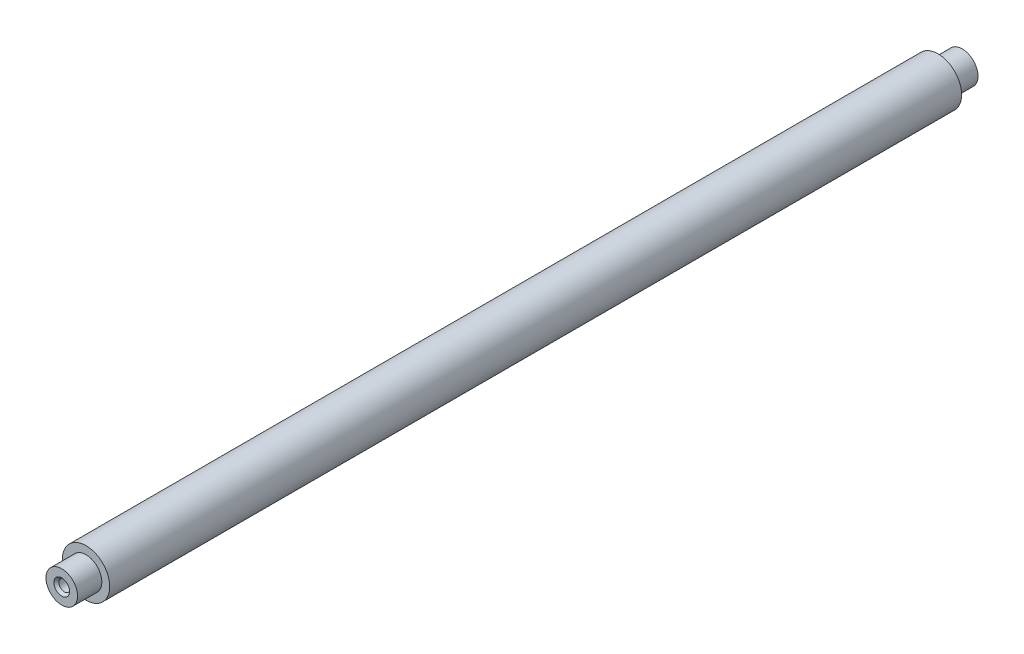
ISO-10303-21;
HEADER;
FILE_DESCRIPTION(('STEP AP214'),'2;1');
FILE_NAME('part.step','',(''),(''),'','','');
FILE_SCHEMA(('AUTOMOTIVE_DESIGN { 1 0 10303 214 1 1 1 1 }'));
ENDSEC;
DATA;
#1=APPLICATION_CONTEXT('core data for automotive mechanical design processes');
#2=APPLICATION_PROTOCOL_DEFINITION('international standard','automotive_design',2000,#1);
#3=PRODUCT_CONTEXT('',#1,'mechanical');
#4=PRODUCT('Part','Part','',(#3));
#5=PRODUCT_RELATED_PRODUCT_CATEGORY('part','',(#4));
#6=PRODUCT_DEFINITION_FORMATION('','',#4);
#7=PRODUCT_DEFINITION_CONTEXT('part definition',#1,'design');
#8=PRODUCT_DEFINITION('design','',#6,#7);
#9=PRODUCT_DEFINITION_SHAPE('','',#8);
#10=(LENGTH_UNIT() NAMED_UNIT(*) SI_UNIT(.MILLI.,.METRE.));
#11=(NAMED_UNIT(*) PLANE_ANGLE_UNIT() SI_UNIT($,.RADIAN.));
#12=(NAMED_UNIT(*) SI_UNIT($,.STERADIAN.) SOLID_ANGLE_UNIT());
#13=UNCERTAINTY_MEASURE_WITH_UNIT(LENGTH_MEASURE(1.E-05),#10,'distance_accuracy_value','');
#14=(GEOMETRIC_REPRESENTATION_CONTEXT(3) GLOBAL_UNCERTAINTY_ASSIGNED_CONTEXT((#13)) GLOBAL_UNIT_ASSIGNED_CONTEXT((#10,
#11,#12)) REPRESENTATION_CONTEXT('',''));
#15=CARTESIAN_POINT('',(0.,0.,0.));
#16=DIRECTION('',(0.,0.,1.));
#17=DIRECTION('',(1.,0.,0.));
#18=AXIS2_PLACEMENT_3D('',#15,#16,#17);
#19=CARTESIAN_POINT('',(0.,0.,342.9));
#20=DIRECTION('',(0.,0.,-1.));
#21=DIRECTION('',(-1.,0.,0.));
#22=AXIS2_PLACEMENT_3D('',#19,#20,#21);
#23=CYLINDRICAL_SURFACE('',#22,9.525);
#24=CARTESIAN_POINT('',(0.,0.,342.9));
#25=DIRECTION('',(0.,0.,1.));
#26=DIRECTION('',(1.,0.,0.));
#27=AXIS2_PLACEMENT_3D('',#24,#25,#26);
#28=CIRCLE('',#27,9.525);
#29=CARTESIAN_POINT('',(9.525,0.,342.9));
#30=VERTEX_POINT('',#29);
#31=EDGE_CURVE('E81',#30,#30,#28,.T.);
#32=ORIENTED_EDGE('',*,*,#31,.F.);
#33=EDGE_LOOP('',(#32));
#34=FACE_BOUND('',#33,.T.);
#35=CARTESIAN_POINT('',(0.,0.,0.));
#36=DIRECTION('',(0.,0.,1.));
#37=DIRECTION('',(1.,0.,0.));
#38=AXIS2_PLACEMENT_3D('',#35,#36,#37);
#39=CIRCLE('',#38,9.525);
#40=CARTESIAN_POINT('',(9.525,0.,0.));
#41=VERTEX_POINT('',#40);
#42=EDGE_CURVE('E36',#41,#41,#39,.T.);
#43=ORIENTED_EDGE('',*,*,#42,.T.);
#44=EDGE_LOOP('',(#43));
#45=FACE_BOUND('',#44,.T.);
#46=ADVANCED_FACE('F33',(#34,#45),#23,.T.);
#47=CARTESIAN_POINT('',(0.,0.,342.9));
#48=DIRECTION('',(0.,0.,1.));
#49=DIRECTION('',(1.,0.,0.));
#50=AXIS2_PLACEMENT_3D('',#47,#48,#49);
#51=PLANE('',#50);
#52=CARTESIAN_POINT('',(0.,0.,342.9));
#53=DIRECTION('',(0.,0.,1.));
#54=DIRECTION('',(1.,0.,0.));
#55=AXIS2_PLACEMENT_3D('',#52,#53,#54);
#56=CIRCLE('',#55,6.35);
#57=CARTESIAN_POINT('',(6.35,0.,342.9));
#58=VERTEX_POINT('',#57);
#59=EDGE_CURVE('E41',#58,#58,#56,.T.);
#60=ORIENTED_EDGE('',*,*,#59,.F.);
#61=EDGE_LOOP('',(#60));
#62=FACE_BOUND('',#61,.T.);
#63=ORIENTED_EDGE('',*,*,#31,.T.);
#64=EDGE_LOOP('',(#63));
#65=FACE_BOUND('',#64,.T.);
#66=ADVANCED_FACE('F92',(#62,#65),#51,.T.);
#67=CARTESIAN_POINT('',(0.,0.,0.));
#68=DIRECTION('',(0.,0.,1.));
#69=DIRECTION('',(1.,0.,0.));
#70=AXIS2_PLACEMENT_3D('',#67,#68,#69);
#71=PLANE('',#70);
#72=CARTESIAN_POINT('',(0.,0.,0.));
#73=DIRECTION('',(0.,0.,-1.));
#74=DIRECTION('',(-1.,0.,0.));
#75=AXIS2_PLACEMENT_3D('',#72,#73,#74);
#76=CIRCLE('',#75,6.35);
#77=CARTESIAN_POINT('',(-6.35,0.,0.));
#78=VERTEX_POINT('',#77);
#79=EDGE_CURVE('E11',#78,#78,#76,.T.);
#80=ORIENTED_EDGE('',*,*,#79,.F.);
#81=EDGE_LOOP('',(#80));
#82=FACE_BOUND('',#81,.T.);
#83=ORIENTED_EDGE('',*,*,#42,.F.);
#84=EDGE_LOOP('',(#83));
#85=FACE_BOUND('',#84,.T.);
#86=ADVANCED_FACE('F89',(#82,#85),#71,.F.);
#87=CARTESIAN_POINT('',(0.,0.,352.679));
#88=DIRECTION('',(0.,0.,-1.));
#89=DIRECTION('',(-1.,0.,0.));
#90=AXIS2_PLACEMENT_3D('',#87,#88,#89);
#91=CYLINDRICAL_SURFACE('',#90,6.35);
#92=CARTESIAN_POINT('',(0.,0.,352.679));
#93=DIRECTION('',(0.,0.,1.));
#94=DIRECTION('',(1.,0.,0.));
#95=AXIS2_PLACEMENT_3D('',#92,#93,#94);
#96=CIRCLE('',#95,6.35);
#97=CARTESIAN_POINT('',(6.35,0.,352.679));
#98=VERTEX_POINT('',#97);
#99=EDGE_CURVE('E77',#98,#98,#96,.T.);
#100=ORIENTED_EDGE('',*,*,#99,.F.);
#101=EDGE_LOOP('',(#100));
#102=FACE_BOUND('',#101,.T.);
#103=ORIENTED_EDGE('',*,*,#59,.T.);
#104=EDGE_LOOP('',(#103));
#105=FACE_BOUND('',#104,.T.);
#106=ADVANCED_FACE('F91',(#102,#105),#91,.T.);
#107=CARTESIAN_POINT('',(0.,0.,352.679));
#108=DIRECTION('',(0.,0.,1.));
#109=DIRECTION('',(1.,0.,0.));
#110=AXIS2_PLACEMENT_3D('',#107,#108,#109);
#111=PLANE('',#110);
#112=CARTESIAN_POINT('',(0.,0.,352.679));
#113=DIRECTION('',(0.,0.,1.));
#114=DIRECTION('',(1.,0.,0.));
#115=AXIS2_PLACEMENT_3D('',#112,#113,#114);
#116=CIRCLE('',#115,3.175);
#117=CARTESIAN_POINT('',(3.175,0.,352.679));
#118=VERTEX_POINT('',#117);
#119=EDGE_CURVE('E62',#118,#118,#116,.T.);
#120=ORIENTED_EDGE('',*,*,#119,.F.);
#121=EDGE_LOOP('',(#120));
#122=FACE_BOUND('',#121,.T.);
#123=ORIENTED_EDGE('',*,*,#99,.T.);
#124=EDGE_LOOP('',(#123));
#125=FACE_BOUND('',#124,.T.);
#126=ADVANCED_FACE('F98',(#122,#125),#111,.T.);
#127=CARTESIAN_POINT('',(0.,0.,327.279));
#128=DIRECTION('',(0.,0.,1.));
#129=DIRECTION('',(1.,0.,0.));
#130=AXIS2_PLACEMENT_3D('',#127,#128,#129);
#131=CONICAL_SURFACE('',#130,2.24789999999998,1.02974425867664);
#132=CARTESIAN_POINT('',(0.,0.,325.928325414488));
#133=VERTEX_POINT('',#132);
#134=VERTEX_LOOP('',#133);
#135=FACE_BOUND('',#134,.T.);
#136=CARTESIAN_POINT('',(0.,0.,327.279));
#137=DIRECTION('',(0.,0.,1.));
#138=DIRECTION('',(1.,0.,0.));
#139=AXIS2_PLACEMENT_3D('',#136,#137,#138);
#140=CIRCLE('',#139,2.24789999999998);
#141=CARTESIAN_POINT('',(2.24789999999998,0.,327.279));
#142=VERTEX_POINT('',#141);
#143=EDGE_CURVE('E74',#142,#142,#140,.T.);
#144=ORIENTED_EDGE('',*,*,#143,.T.);
#145=EDGE_LOOP('',(#144));
#146=FACE_BOUND('',#145,.T.);
#147=ADVANCED_FACE('F128',(#135,#146),#131,.F.);
#148=CARTESIAN_POINT('',(0.,0.,352.679));
#149=DIRECTION('',(0.,0.,1.));
#150=DIRECTION('',(1.,0.,0.));
#151=AXIS2_PLACEMENT_3D('',#148,#149,#150);
#152=CYLINDRICAL_SURFACE('',#151,2.24789999999999);
#153=ORIENTED_EDGE('',*,*,#143,.F.);
#154=EDGE_LOOP('',(#153));
#155=FACE_BOUND('',#154,.T.);
#156=CARTESIAN_POINT('',(0.,0.,351.612493449665));
#157=DIRECTION('',(0.,0.,1.));
#158=DIRECTION('',(1.,0.,0.));
#159=AXIS2_PLACEMENT_3D('',#156,#157,#158);
#160=CIRCLE('',#159,2.2479);
#161=CARTESIAN_POINT('',(2.2479,0.,351.612493449665));
#162=VERTEX_POINT('',#161);
#163=EDGE_CURVE('E71',#162,#162,#160,.T.);
#164=ORIENTED_EDGE('',*,*,#163,.T.);
#165=EDGE_LOOP('',(#164));
#166=FACE_BOUND('',#165,.T.);
#167=ADVANCED_FACE('F138',(#155,#166),#152,.F.);
#168=CARTESIAN_POINT('',(0.,0.,352.679));
#169=DIRECTION('',(0.,0.,1.));
#170=DIRECTION('',(1.,0.,0.));
#171=AXIS2_PLACEMENT_3D('',#168,#169,#170);
#172=CONICAL_SURFACE('',#171,3.175,0.715584993317686);
#173=ORIENTED_EDGE('',*,*,#163,.F.);
#174=EDGE_LOOP('',(#173));
#175=FACE_BOUND('',#174,.T.);
#176=ORIENTED_EDGE('',*,*,#119,.T.);
#177=EDGE_LOOP('',(#176));
#178=FACE_BOUND('',#177,.T.);
#179=ADVANCED_FACE('F147',(#175,#178),#172,.F.);
#180=CARTESIAN_POINT('',(0.,0.,-9.779));
#181=DIRECTION('',(0.,0.,1.));
#182=DIRECTION('',(1.,0.,0.));
#183=AXIS2_PLACEMENT_3D('',#180,#181,#182);
#184=CYLINDRICAL_SURFACE('',#183,6.35);
#185=CARTESIAN_POINT('',(0.,0.,-9.779));
#186=DIRECTION('',(0.,0.,-1.));
#187=DIRECTION('',(-1.,0.,0.));
#188=AXIS2_PLACEMENT_3D('',#185,#186,#187);
#189=CIRCLE('',#188,6.35);
#190=CARTESIAN_POINT('',(-6.35,0.,-9.779));
#191=VERTEX_POINT('',#190);
#192=EDGE_CURVE('E58',#191,#191,#189,.T.);
#193=ORIENTED_EDGE('',*,*,#192,.F.);
#194=EDGE_LOOP('',(#193));
#195=FACE_BOUND('',#194,.T.);
#196=ORIENTED_EDGE('',*,*,#79,.T.);
#197=EDGE_LOOP('',(#196));
#198=FACE_BOUND('',#197,.T.);
#199=ADVANCED_FACE('F156',(#195,#198),#184,.T.);
#200=CARTESIAN_POINT('',(0.,0.,-9.779));
#201=DIRECTION('',(0.,0.,-1.));
#202=DIRECTION('',(-1.,0.,0.));
#203=AXIS2_PLACEMENT_3D('',#200,#201,#202);
#204=PLANE('',#203);
#205=CARTESIAN_POINT('',(0.,0.,-9.779));
#206=DIRECTION('',(0.,0.,-1.));
#207=DIRECTION('',(-1.,0.,0.));
#208=AXIS2_PLACEMENT_3D('',#205,#206,#207);
#209=CIRCLE('',#208,3.175);
#210=CARTESIAN_POINT('',(-3.175,0.,-9.779));
#211=VERTEX_POINT('',#210);
#212=EDGE_CURVE('E65',#211,#211,#209,.T.);
#213=ORIENTED_EDGE('',*,*,#212,.F.);
#214=EDGE_LOOP('',(#213));
#215=FACE_BOUND('',#214,.T.);
#216=ORIENTED_EDGE('',*,*,#192,.T.);
#217=EDGE_LOOP('',(#216));
#218=FACE_BOUND('',#217,.T.);
#219=ADVANCED_FACE('F52',(#215,#218),#204,.T.);
#220=CARTESIAN_POINT('',(0.,0.,15.621));
#221=DIRECTION('',(0.,0.,-1.));
#222=DIRECTION('',(-1.,0.,0.));
#223=AXIS2_PLACEMENT_3D('',#220,#221,#222);
#224=CONICAL_SURFACE('',#223,2.24789999999998,1.02974425867665);
#225=CARTESIAN_POINT('',(0.,0.,16.9716745855121));
#226=VERTEX_POINT('',#225);
#227=VERTEX_LOOP('',#226);
#228=FACE_BOUND('',#227,.T.);
#229=CARTESIAN_POINT('',(0.,0.,15.621));
#230=DIRECTION('',(0.,0.,-1.));
#231=DIRECTION('',(-1.,0.,0.));
#232=AXIS2_PLACEMENT_3D('',#229,#230,#231);
#233=CIRCLE('',#232,2.24789999999998);
#234=CARTESIAN_POINT('',(-2.24789999999998,0.,15.621));
#235=VERTEX_POINT('',#234);
#236=EDGE_CURVE('E56',#235,#235,#233,.T.);
#237=ORIENTED_EDGE('',*,*,#236,.T.);
#238=EDGE_LOOP('',(#237));
#239=FACE_BOUND('',#238,.T.);
#240=ADVANCED_FACE('F48',(#228,#239),#224,.F.);
#241=CARTESIAN_POINT('',(0.,0.,-9.779));
#242=DIRECTION('',(0.,0.,-1.));
#243=DIRECTION('',(-1.,0.,0.));
#244=AXIS2_PLACEMENT_3D('',#241,#242,#243);
#245=CYLINDRICAL_SURFACE('',#244,2.24789999999999);
#246=ORIENTED_EDGE('',*,*,#236,.F.);
#247=EDGE_LOOP('',(#246));
#248=FACE_BOUND('',#247,.T.);
#249=CARTESIAN_POINT('',(0.,0.,-8.7124934496654));
#250=DIRECTION('',(0.,0.,-1.));
#251=DIRECTION('',(-1.,0.,0.));
#252=AXIS2_PLACEMENT_3D('',#249,#250,#251);
#253=CIRCLE('',#252,2.2479);
#254=CARTESIAN_POINT('',(-2.2479,0.,-8.7124934496654));
#255=VERTEX_POINT('',#254);
#256=EDGE_CURVE('E59',#255,#255,#253,.T.);
#257=ORIENTED_EDGE('',*,*,#256,.T.);
#258=EDGE_LOOP('',(#257));
#259=FACE_BOUND('',#258,.T.);
#260=ADVANCED_FACE('F51',(#248,#259),#245,.F.);
#261=CARTESIAN_POINT('',(0.,0.,-9.779));
#262=DIRECTION('',(0.,0.,-1.));
#263=DIRECTION('',(-1.,0.,0.));
#264=AXIS2_PLACEMENT_3D('',#261,#262,#263);
#265=CONICAL_SURFACE('',#264,3.175,0.715584993317676);
#266=ORIENTED_EDGE('',*,*,#256,.F.);
#267=EDGE_LOOP('',(#266));
#268=FACE_BOUND('',#267,.T.);
#269=ORIENTED_EDGE('',*,*,#212,.T.);
#270=EDGE_LOOP('',(#269));
#271=FACE_BOUND('',#270,.T.);
#272=ADVANCED_FACE('F194',(#268,#271),#265,.F.);
#273=CLOSED_SHELL('',(#46,#66,#86,#106,#126,#147,#167,#179,#199,#219,#240,#260,#272));
#274=MANIFOLD_SOLID_BREP('B2',#273);
#275=ADVANCED_BREP_SHAPE_REPRESENTATION('',(#18,#274),#14);
#276=SHAPE_DEFINITION_REPRESENTATION(#9,#275);
ENDSEC;
END-ISO-10303-21;
